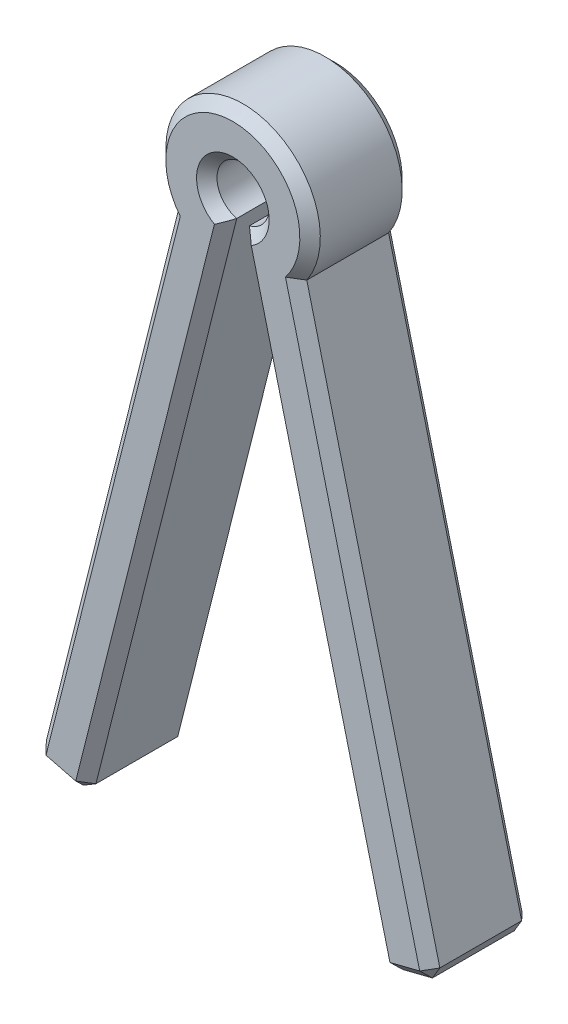
ISO-10303-21;
HEADER;
FILE_DESCRIPTION(('STEP AP214'),'2;1');
FILE_NAME('part.step','',(''),(''),'','','');
FILE_SCHEMA(('AUTOMOTIVE_DESIGN { 1 0 10303 214 1 1 1 1 }'));
ENDSEC;
DATA;
#1=APPLICATION_CONTEXT('core data for automotive mechanical design processes');
#2=APPLICATION_PROTOCOL_DEFINITION('international standard','automotive_design',2000,#1);
#3=PRODUCT_CONTEXT('',#1,'mechanical');
#4=PRODUCT('Part','Part','',(#3));
#5=PRODUCT_RELATED_PRODUCT_CATEGORY('part','',(#4));
#6=PRODUCT_DEFINITION_FORMATION('','',#4);
#7=PRODUCT_DEFINITION_CONTEXT('part definition',#1,'design');
#8=PRODUCT_DEFINITION('design','',#6,#7);
#9=PRODUCT_DEFINITION_SHAPE('','',#8);
#10=(LENGTH_UNIT() NAMED_UNIT(*) SI_UNIT(.MILLI.,.METRE.));
#11=(NAMED_UNIT(*) PLANE_ANGLE_UNIT() SI_UNIT($,.RADIAN.));
#12=(NAMED_UNIT(*) SI_UNIT($,.STERADIAN.) SOLID_ANGLE_UNIT());
#13=UNCERTAINTY_MEASURE_WITH_UNIT(LENGTH_MEASURE(1.E-05),#10,'distance_accuracy_value','');
#14=(GEOMETRIC_REPRESENTATION_CONTEXT(3) GLOBAL_UNCERTAINTY_ASSIGNED_CONTEXT((#13)) GLOBAL_UNIT_ASSIGNED_CONTEXT((#10,
#11,#12)) REPRESENTATION_CONTEXT('',''));
#15=CARTESIAN_POINT('',(0.,0.,0.));
#16=DIRECTION('',(0.,0.,1.));
#17=DIRECTION('',(1.,0.,0.));
#18=AXIS2_PLACEMENT_3D('',#15,#16,#17);
#19=CARTESIAN_POINT('',(-5.4708853835864,-1.2537595940453,10.));
#20=DIRECTION('',(0.969812360376083,-0.243852384982742,0.));
#21=DIRECTION('',(0.243852384982742,0.969812360376083,0.));
#22=AXIS2_PLACEMENT_3D('',#19,#20,#21);
#23=PLANE('',#22);
#24=DIRECTION('',(0.,0.,-1.));
#25=VECTOR('',#24,1.);
#26=CARTESIAN_POINT('',(-6.22855308533995,-4.26703954318473,10.));
#27=LINE('',#26,#25);
#28=CARTESIAN_POINT('',(-6.22855308533995,-4.26703954318473,8.99999999999999));
#29=VERTEX_POINT('',#28);
#30=CARTESIAN_POINT('',(-6.22855308533995,-4.26703954318473,1.00000000000001));
#31=VERTEX_POINT('',#30);
#32=EDGE_CURVE('E482',#29,#31,#27,.T.);
#33=ORIENTED_EDGE('',*,*,#32,.T.);
#34=DIRECTION('',(-0.243852384982742,-0.969812360376083,0.));
#35=VECTOR('',#34,1.);
#36=CARTESIAN_POINT('',(-5.4708853835864,-1.2537595940453,1.00000000000001));
#37=LINE('',#36,#35);
#38=CARTESIAN_POINT('',(-19.2363525158622,-55.9996673372752,1.00000000000001));
#39=VERTEX_POINT('',#38);
#40=EDGE_CURVE('E270',#31,#39,#37,.T.);
#41=ORIENTED_EDGE('',*,*,#40,.T.);
#42=DIRECTION('',(0.,0.,1.));
#43=VECTOR('',#42,1.);
#44=CARTESIAN_POINT('',(-19.2363525158622,-55.9996673372752,10.));
#45=LINE('',#44,#43);
#46=CARTESIAN_POINT('',(-19.2363525158622,-55.9996673372752,8.99999999999999));
#47=VERTEX_POINT('',#46);
#48=EDGE_CURVE('E266',#39,#47,#45,.T.);
#49=ORIENTED_EDGE('',*,*,#48,.T.);
#50=DIRECTION('',(0.243852384982742,0.969812360376083,0.));
#51=VECTOR('',#50,1.);
#52=CARTESIAN_POINT('',(-6.22855308533995,-4.26703954318473,8.99999999999999));
#53=LINE('',#52,#51);
#54=EDGE_CURVE('E268',#47,#29,#53,.T.);
#55=ORIENTED_EDGE('',*,*,#54,.T.);
#56=EDGE_LOOP('',(#33,#41,#49,#55));
#57=FACE_BOUND('',#56,.T.);
#58=ADVANCED_FACE('F43',(#57),#23,.F.);
#59=CARTESIAN_POINT('',(-14.6311430989645,-58.188741622565,10.));
#60=DIRECTION('',(-0.243852384982739,-0.969812360376083,0.));
#61=DIRECTION('',(0.969812360376083,-0.243852384982739,0.));
#62=AXIS2_PLACEMENT_3D('',#59,#60,#61);
#63=PLANE('',#62);
#64=DIRECTION('',(0.,0.,-1.));
#65=VECTOR('',#64,1.);
#66=CARTESIAN_POINT('',(-18.5103925404688,-57.213332082634,0.));
#67=LINE('',#66,#65);
#68=CARTESIAN_POINT('',(-18.5103925404688,-57.213332082634,9.));
#69=VERTEX_POINT('',#68);
#70=CARTESIAN_POINT('',(-18.5103925404688,-57.213332082634,0.999999999999997));
#71=VERTEX_POINT('',#70);
#72=EDGE_CURVE('E217',#69,#71,#67,.T.);
#73=ORIENTED_EDGE('',*,*,#72,.T.);
#74=DIRECTION('',(0.969812360376083,-0.243852384982739,0.));
#75=VECTOR('',#74,1.);
#76=CARTESIAN_POINT('',(-14.6311430989645,-58.188741622565,0.999999999999997));
#77=LINE('',#76,#75);
#78=CARTESIAN_POINT('',(-15.6009554593406,-57.9448892375822,0.999999999999997));
#79=VERTEX_POINT('',#78);
#80=EDGE_CURVE('E188',#71,#79,#77,.T.);
#81=ORIENTED_EDGE('',*,*,#80,.T.);
#82=DIRECTION('',(0.,0.,1.));
#83=VECTOR('',#82,1.);
#84=CARTESIAN_POINT('',(-15.6009554593406,-57.9448892375822,10.));
#85=LINE('',#84,#83);
#86=CARTESIAN_POINT('',(-15.6009554593406,-57.9448892375822,9.));
#87=VERTEX_POINT('',#86);
#88=EDGE_CURVE('E226',#79,#87,#85,.T.);
#89=ORIENTED_EDGE('',*,*,#88,.T.);
#90=DIRECTION('',(-0.969812360376083,0.243852384982739,0.));
#91=VECTOR('',#90,1.);
#92=CARTESIAN_POINT('',(-14.6311430989645,-58.188741622565,9.));
#93=LINE('',#92,#91);
#94=EDGE_CURVE('E219',#87,#69,#93,.T.);
#95=ORIENTED_EDGE('',*,*,#94,.T.);
#96=EDGE_LOOP('',(#73,#81,#89,#95));
#97=FACE_BOUND('',#96,.T.);
#98=ADVANCED_FACE('F526',(#97),#63,.T.);
#99=CARTESIAN_POINT('',(-0.621823581705991,-2.47302151895901,10.));
#100=DIRECTION('',(0.969812360376083,-0.243852384982742,0.));
#101=DIRECTION('',(0.243852384982742,0.969812360376083,0.));
#102=AXIS2_PLACEMENT_3D('',#99,#100,#101);
#103=PLANE('',#102);
#104=DIRECTION('',(0.,0.,-1.));
#105=VECTOR('',#104,1.);
#106=CARTESIAN_POINT('',(-14.3872907139818,-57.2189292621889,10.));
#107=LINE('',#106,#105);
#108=CARTESIAN_POINT('',(-14.3872907139818,-57.2189292621889,9.));
#109=VERTEX_POINT('',#108);
#110=CARTESIAN_POINT('',(-14.3872907139818,-57.2189292621889,1.00000000000001));
#111=VERTEX_POINT('',#110);
#112=EDGE_CURVE('E229',#109,#111,#107,.T.);
#113=ORIENTED_EDGE('',*,*,#112,.T.);
#114=DIRECTION('',(0.243852384982742,0.969812360376083,0.));
#115=VECTOR('',#114,1.);
#116=CARTESIAN_POINT('',(-0.621823581705991,-2.47302151895901,1.00000000000001));
#117=LINE('',#116,#115);
#118=CARTESIAN_POINT('',(-0.621823581705994,-2.47302151895901,1.00000000000001));
#119=VERTEX_POINT('',#118);
#120=EDGE_CURVE('E233',#111,#119,#117,.T.);
#121=ORIENTED_EDGE('',*,*,#120,.T.);
#122=DIRECTION('',(0.,0.,-1.));
#123=VECTOR('',#122,1.);
#124=CARTESIAN_POINT('',(-0.621823581705994,-2.47302151895901,10.));
#125=LINE('',#124,#123);
#126=CARTESIAN_POINT('',(-0.621823581705994,-2.47302151895901,9.));
#127=VERTEX_POINT('',#126);
#128=EDGE_CURVE('E211',#127,#119,#125,.T.);
#129=ORIENTED_EDGE('',*,*,#128,.F.);
#130=DIRECTION('',(-0.243852384982742,-0.969812360376083,0.));
#131=VECTOR('',#130,1.);
#132=CARTESIAN_POINT('',(-0.621823581705991,-2.47302151895901,9.));
#133=LINE('',#132,#131);
#134=EDGE_CURVE('E231',#127,#109,#133,.T.);
#135=ORIENTED_EDGE('',*,*,#134,.T.);
#136=EDGE_LOOP('',(#113,#121,#129,#135));
#137=FACE_BOUND('',#136,.T.);
#138=ADVANCED_FACE('F596',(#137),#103,.T.);
#139=CARTESIAN_POINT('',(0.,0.,10.));
#140=DIRECTION('',(0.,0.,-1.));
#141=DIRECTION('',(-1.,0.,0.));
#142=AXIS2_PLACEMENT_3D('',#139,#140,#141);
#143=CYLINDRICAL_SURFACE('',#142,2.55);
#144=ORIENTED_EDGE('',*,*,#128,.T.);
#145=CARTESIAN_POINT('',(0.,0.,1.00000000000001));
#146=DIRECTION('',(0.,0.,1.));
#147=DIRECTION('',(1.,0.,0.));
#148=AXIS2_PLACEMENT_3D('',#145,#146,#147);
#149=CIRCLE('',#148,2.55);
#150=CARTESIAN_POINT('',(0.621823581705991,-2.47302151895901,1.00000000000001));
#151=VERTEX_POINT('',#150);
#152=EDGE_CURVE('E238',#119,#151,#149,.F.);
#153=ORIENTED_EDGE('',*,*,#152,.T.);
#154=DIRECTION('',(0.,0.,-1.));
#155=VECTOR('',#154,1.);
#156=CARTESIAN_POINT('',(0.621823581705991,-2.47302151895901,10.));
#157=LINE('',#156,#155);
#158=CARTESIAN_POINT('',(0.621823581705991,-2.47302151895901,9.));
#159=VERTEX_POINT('',#158);
#160=EDGE_CURVE('E493',#159,#151,#157,.T.);
#161=ORIENTED_EDGE('',*,*,#160,.F.);
#162=CARTESIAN_POINT('',(0.,0.,9.));
#163=DIRECTION('',(0.,0.,1.));
#164=DIRECTION('',(1.,0.,0.));
#165=AXIS2_PLACEMENT_3D('',#162,#163,#164);
#166=CIRCLE('',#165,2.55);
#167=EDGE_CURVE('E236',#159,#127,#166,.T.);
#168=ORIENTED_EDGE('',*,*,#167,.T.);
#169=EDGE_LOOP('',(#144,#153,#161,#168));
#170=FACE_BOUND('',#169,.T.);
#171=ADVANCED_FACE('F821',(#170),#143,.F.);
#172=CARTESIAN_POINT('',(0.621823581705991,-2.47302151895901,10.));
#173=DIRECTION('',(-0.969812360376083,-0.243852384982742,0.));
#174=DIRECTION('',(0.243852384982742,-0.969812360376083,0.));
#175=AXIS2_PLACEMENT_3D('',#172,#173,#174);
#176=PLANE('',#175);
#177=ORIENTED_EDGE('',*,*,#160,.T.);
#178=DIRECTION('',(0.243852384982742,-0.969812360376083,0.));
#179=VECTOR('',#178,1.);
#180=CARTESIAN_POINT('',(14.6311430989645,-58.188741622565,1.00000000000001));
#181=LINE('',#180,#179);
#182=CARTESIAN_POINT('',(14.3872907139818,-57.2189292621889,1.00000000000001));
#183=VERTEX_POINT('',#182);
#184=EDGE_CURVE('E244',#151,#183,#181,.T.);
#185=ORIENTED_EDGE('',*,*,#184,.T.);
#186=DIRECTION('',(0.,0.,1.));
#187=VECTOR('',#186,1.);
#188=CARTESIAN_POINT('',(14.3872907139818,-57.2189292621889,10.));
#189=LINE('',#188,#187);
#190=CARTESIAN_POINT('',(14.3872907139818,-57.2189292621889,9.));
#191=VERTEX_POINT('',#190);
#192=EDGE_CURVE('E242',#183,#191,#189,.T.);
#193=ORIENTED_EDGE('',*,*,#192,.T.);
#194=DIRECTION('',(-0.243852384982742,0.969812360376083,0.));
#195=VECTOR('',#194,1.);
#196=CARTESIAN_POINT('',(0.621823581705991,-2.47302151895901,9.));
#197=LINE('',#196,#195);
#198=EDGE_CURVE('E240',#191,#159,#197,.T.);
#199=ORIENTED_EDGE('',*,*,#198,.T.);
#200=EDGE_LOOP('',(#177,#185,#193,#199));
#201=FACE_BOUND('',#200,.T.);
#202=ADVANCED_FACE('F812',(#201),#176,.T.);
#203=CARTESIAN_POINT('',(19.4802049008449,-56.9694796976513,10.));
#204=DIRECTION('',(0.243852384982739,-0.969812360376083,0.));
#205=DIRECTION('',(0.969812360376083,0.243852384982739,0.));
#206=AXIS2_PLACEMENT_3D('',#203,#204,#205);
#207=PLANE('',#206);
#208=DIRECTION('',(0.,0.,-1.));
#209=VECTOR('',#208,1.);
#210=CARTESIAN_POINT('',(15.6009554593406,-57.9448892375822,10.));
#211=LINE('',#210,#209);
#212=CARTESIAN_POINT('',(15.6009554593406,-57.9448892375822,9.));
#213=VERTEX_POINT('',#212);
#214=CARTESIAN_POINT('',(15.6009554593406,-57.9448892375822,1.00000000000001));
#215=VERTEX_POINT('',#214);
#216=EDGE_CURVE('E246',#213,#215,#211,.T.);
#217=ORIENTED_EDGE('',*,*,#216,.T.);
#218=DIRECTION('',(0.969812360376083,0.243852384982739,0.));
#219=VECTOR('',#218,1.);
#220=CARTESIAN_POINT('',(19.4802049008449,-56.9694796976513,1.00000000000001));
#221=LINE('',#220,#219);
#222=CARTESIAN_POINT('',(18.5103925404688,-57.213332082634,1.00000000000001));
#223=VERTEX_POINT('',#222);
#224=EDGE_CURVE('E252',#215,#223,#221,.T.);
#225=ORIENTED_EDGE('',*,*,#224,.T.);
#226=DIRECTION('',(0.,0.,1.));
#227=VECTOR('',#226,1.);
#228=CARTESIAN_POINT('',(18.5103925404688,-57.213332082634,10.));
#229=LINE('',#228,#227);
#230=CARTESIAN_POINT('',(18.5103925404688,-57.213332082634,9.));
#231=VERTEX_POINT('',#230);
#232=EDGE_CURVE('E250',#223,#231,#229,.T.);
#233=ORIENTED_EDGE('',*,*,#232,.T.);
#234=DIRECTION('',(-0.969812360376083,-0.243852384982739,0.));
#235=VECTOR('',#234,1.);
#236=CARTESIAN_POINT('',(19.4802049008449,-56.9694796976513,9.));
#237=LINE('',#236,#235);
#238=EDGE_CURVE('E248',#231,#213,#237,.T.);
#239=ORIENTED_EDGE('',*,*,#238,.T.);
#240=EDGE_LOOP('',(#217,#225,#233,#239));
#241=FACE_BOUND('',#240,.T.);
#242=ADVANCED_FACE('F804',(#241),#207,.T.);
#243=CARTESIAN_POINT('',(5.4708853835864,-1.2537595940453,10.));
#244=DIRECTION('',(-0.969812360376083,-0.243852384982742,0.));
#245=DIRECTION('',(0.243852384982742,-0.969812360376083,0.));
#246=AXIS2_PLACEMENT_3D('',#243,#244,#245);
#247=PLANE('',#246);
#248=DIRECTION('',(0.,0.,-1.));
#249=VECTOR('',#248,1.);
#250=CARTESIAN_POINT('',(19.2363525158622,-55.9996673372752,0.));
#251=LINE('',#250,#249);
#252=CARTESIAN_POINT('',(19.2363525158622,-55.9996673372752,8.99999999999999));
#253=VERTEX_POINT('',#252);
#254=CARTESIAN_POINT('',(19.2363525158622,-55.9996673372752,0.999999999999997));
#255=VERTEX_POINT('',#254);
#256=EDGE_CURVE('E255',#253,#255,#251,.T.);
#257=ORIENTED_EDGE('',*,*,#256,.T.);
#258=DIRECTION('',(-0.243852384982742,0.969812360376083,0.));
#259=VECTOR('',#258,1.);
#260=CARTESIAN_POINT('',(5.4708853835864,-1.2537595940453,0.999999999999997));
#261=LINE('',#260,#259);
#262=CARTESIAN_POINT('',(6.22855308533995,-4.26703954318473,0.999999999999997));
#263=VERTEX_POINT('',#262);
#264=EDGE_CURVE('E259',#255,#263,#261,.T.);
#265=ORIENTED_EDGE('',*,*,#264,.T.);
#266=DIRECTION('',(0.,0.,-1.));
#267=VECTOR('',#266,1.);
#268=CARTESIAN_POINT('',(6.22855308533995,-4.26703954318473,10.));
#269=LINE('',#268,#267);
#270=CARTESIAN_POINT('',(6.22855308533995,-4.26703954318473,8.99999999999999));
#271=VERTEX_POINT('',#270);
#272=EDGE_CURVE('E488',#271,#263,#269,.T.);
#273=ORIENTED_EDGE('',*,*,#272,.F.);
#274=DIRECTION('',(0.243852384982742,-0.969812360376083,0.));
#275=VECTOR('',#274,1.);
#276=CARTESIAN_POINT('',(19.4802049008449,-56.9694796976513,8.99999999999999));
#277=LINE('',#276,#275);
#278=EDGE_CURVE('E257',#271,#253,#277,.T.);
#279=ORIENTED_EDGE('',*,*,#278,.T.);
#280=EDGE_LOOP('',(#257,#265,#273,#279));
#281=FACE_BOUND('',#280,.T.);
#282=ADVANCED_FACE('F553',(#281),#247,.F.);
#283=CARTESIAN_POINT('',(0.,0.,10.));
#284=DIRECTION('',(0.,0.,-1.));
#285=DIRECTION('',(-1.,0.,0.));
#286=AXIS2_PLACEMENT_3D('',#283,#284,#285);
#287=CYLINDRICAL_SURFACE('',#286,7.55);
#288=ORIENTED_EDGE('',*,*,#272,.T.);
#289=CARTESIAN_POINT('',(0.,0.,0.999999999999997));
#290=DIRECTION('',(0.,0.,1.));
#291=DIRECTION('',(1.,0.,0.));
#292=AXIS2_PLACEMENT_3D('',#289,#290,#291);
#293=CIRCLE('',#292,7.55);
#294=EDGE_CURVE('E264',#263,#31,#293,.T.);
#295=ORIENTED_EDGE('',*,*,#294,.T.);
#296=ORIENTED_EDGE('',*,*,#32,.F.);
#297=CARTESIAN_POINT('',(0.,0.,8.99999999999999));
#298=DIRECTION('',(0.,0.,1.));
#299=DIRECTION('',(1.,0.,0.));
#300=AXIS2_PLACEMENT_3D('',#297,#298,#299);
#301=CIRCLE('',#300,7.55);
#302=EDGE_CURVE('E262',#29,#271,#301,.F.);
#303=ORIENTED_EDGE('',*,*,#302,.T.);
#304=EDGE_LOOP('',(#288,#295,#296,#303));
#305=FACE_BOUND('',#304,.T.);
#306=ADVANCED_FACE('F558',(#305),#287,.T.);
#307=CARTESIAN_POINT('',(0.,0.,10.));
#308=DIRECTION('',(0.,0.,1.));
#309=DIRECTION('',(1.,0.,0.));
#310=AXIS2_PLACEMENT_3D('',#307,#308,#309);
#311=PLANE('',#310);
#312=DIRECTION('',(-0.243852384982742,0.969812360376083,0.));
#313=VECTOR('',#312,1.);
#314=CARTESIAN_POINT('',(5.25874072496387,-4.51089192816748,10.));
#315=LINE('',#314,#313);
#316=CARTESIAN_POINT('',(18.2665401554861,-56.2435197222579,10.));
#317=VERTEX_POINT('',#316);
#318=CARTESIAN_POINT('',(5.14405372449273,-4.05477635382427,10.));
#319=VERTEX_POINT('',#318);
#320=EDGE_CURVE('E53',#317,#319,#315,.T.);
#321=ORIENTED_EDGE('',*,*,#320,.T.);
#322=CARTESIAN_POINT('',(0.,0.,10.));
#323=DIRECTION('',(0.,0.,1.));
#324=DIRECTION('',(1.,0.,0.));
#325=AXIS2_PLACEMENT_3D('',#322,#323,#324);
#326=CIRCLE('',#325,6.55);
#327=CARTESIAN_POINT('',(-5.14405372449273,-4.05477635382428,10.));
#328=VERTEX_POINT('',#327);
#329=EDGE_CURVE('E11',#319,#328,#326,.T.);
#330=ORIENTED_EDGE('',*,*,#329,.T.);
#331=DIRECTION('',(-0.243852384982742,-0.969812360376083,0.));
#332=VECTOR('',#331,1.);
#333=CARTESIAN_POINT('',(-18.5103925404688,-57.213332082634,10.));
#334=LINE('',#333,#332);
#335=CARTESIAN_POINT('',(-18.2665401554861,-56.2435197222579,10.));
#336=VERTEX_POINT('',#335);
#337=EDGE_CURVE('E272',#328,#336,#334,.T.);
#338=ORIENTED_EDGE('',*,*,#337,.T.);
#339=DIRECTION('',(0.969812360376084,-0.243852384982739,0.));
#340=VECTOR('',#339,1.);
#341=CARTESIAN_POINT('',(-14.3872907139816,-57.2189292621889,10.));
#342=LINE('',#341,#340);
#343=CARTESIAN_POINT('',(-15.3571030743578,-56.9750768772061,10.));
#344=VERTEX_POINT('',#343);
#345=EDGE_CURVE('E274',#336,#344,#342,.T.);
#346=ORIENTED_EDGE('',*,*,#345,.T.);
#347=DIRECTION('',(0.243852384982742,0.969812360376083,0.));
#348=VECTOR('',#347,1.);
#349=CARTESIAN_POINT('',(-0.969812360376089,0.243852384982743,10.));
#350=LINE('',#349,#348);
#351=CARTESIAN_POINT('',(-1.80043314848622,-3.05956540669292,10.));
#352=VERTEX_POINT('',#351);
#353=EDGE_CURVE('E276',#344,#352,#350,.T.);
#354=ORIENTED_EDGE('',*,*,#353,.T.);
#355=CARTESIAN_POINT('',(0.,0.,10.));
#356=DIRECTION('',(0.,0.,1.));
#357=DIRECTION('',(1.,0.,0.));
#358=AXIS2_PLACEMENT_3D('',#355,#356,#357);
#359=CIRCLE('',#358,3.55000000000001);
#360=CARTESIAN_POINT('',(1.80043314848623,-3.05956540669292,10.));
#361=VERTEX_POINT('',#360);
#362=EDGE_CURVE('E278',#352,#361,#359,.F.);
#363=ORIENTED_EDGE('',*,*,#362,.T.);
#364=DIRECTION('',(0.243852384982742,-0.969812360376083,0.));
#365=VECTOR('',#364,1.);
#366=CARTESIAN_POINT('',(0.96981236037609,0.243852384982743,10.));
#367=LINE('',#366,#365);
#368=CARTESIAN_POINT('',(15.3571030743578,-56.9750768772061,10.));
#369=VERTEX_POINT('',#368);
#370=EDGE_CURVE('E280',#361,#369,#367,.T.);
#371=ORIENTED_EDGE('',*,*,#370,.T.);
#372=DIRECTION('',(0.969812360376084,0.243852384982739,0.));
#373=VECTOR('',#372,1.);
#374=CARTESIAN_POINT('',(14.3872907139816,-57.2189292621889,10.));
#375=LINE('',#374,#373);
#376=EDGE_CURVE('E64',#369,#317,#375,.T.);
#377=ORIENTED_EDGE('',*,*,#376,.T.);
#378=EDGE_LOOP('',(#321,#330,#338,#346,#354,#363,#371,#377));
#379=FACE_BOUND('',#378,.T.);
#380=ADVANCED_FACE('F582',(#379),#311,.T.);
#381=CARTESIAN_POINT('',(0.,0.,0.));
#382=DIRECTION('',(0.,0.,1.));
#383=DIRECTION('',(1.,0.,0.));
#384=AXIS2_PLACEMENT_3D('',#381,#382,#383);
#385=PLANE('',#384);
#386=DIRECTION('',(-0.243852384982742,-0.969812360376083,0.));
#387=VECTOR('',#386,1.);
#388=CARTESIAN_POINT('',(-15.6009554593406,-57.9448892375822,0.));
#389=LINE('',#388,#387);
#390=CARTESIAN_POINT('',(-1.80043314848621,-3.05956540669292,0.));
#391=VERTEX_POINT('',#390);
#392=CARTESIAN_POINT('',(-15.3571030743578,-56.9750768772061,0.));
#393=VERTEX_POINT('',#392);
#394=EDGE_CURVE('E215',#391,#393,#389,.T.);
#395=ORIENTED_EDGE('',*,*,#394,.T.);
#396=DIRECTION('',(-0.969812360376084,0.243852384982739,0.));
#397=VECTOR('',#396,1.);
#398=CARTESIAN_POINT('',(-19.2363525158622,-55.9996673372752,0.));
#399=LINE('',#398,#397);
#400=CARTESIAN_POINT('',(-18.2665401554861,-56.2435197222579,0.));
#401=VERTEX_POINT('',#400);
#402=EDGE_CURVE('E186',#393,#401,#399,.T.);
#403=ORIENTED_EDGE('',*,*,#402,.T.);
#404=DIRECTION('',(0.243852384982742,0.969812360376083,0.));
#405=VECTOR('',#404,1.);
#406=CARTESIAN_POINT('',(-3.87924944150433,0.975409539930967,0.));
#407=LINE('',#406,#405);
#408=CARTESIAN_POINT('',(-5.14405372449273,-4.05477635382426,0.));
#409=VERTEX_POINT('',#408);
#410=EDGE_CURVE('E204',#401,#409,#407,.T.);
#411=ORIENTED_EDGE('',*,*,#410,.T.);
#412=CARTESIAN_POINT('',(0.,0.,0.));
#413=DIRECTION('',(0.,0.,1.));
#414=DIRECTION('',(1.,0.,0.));
#415=AXIS2_PLACEMENT_3D('',#412,#413,#414);
#416=CIRCLE('',#415,6.54999999999999);
#417=CARTESIAN_POINT('',(5.14405372449272,-4.05477635382427,0.));
#418=VERTEX_POINT('',#417);
#419=EDGE_CURVE('E210',#409,#418,#416,.F.);
#420=ORIENTED_EDGE('',*,*,#419,.T.);
#421=DIRECTION('',(0.243852384982742,-0.969812360376083,0.));
#422=VECTOR('',#421,1.);
#423=CARTESIAN_POINT('',(3.87924944150433,0.975409539930965,0.));
#424=LINE('',#423,#422);
#425=CARTESIAN_POINT('',(18.2665401554861,-56.2435197222579,0.));
#426=VERTEX_POINT('',#425);
#427=EDGE_CURVE('E501',#418,#426,#424,.T.);
#428=ORIENTED_EDGE('',*,*,#427,.T.);
#429=DIRECTION('',(-0.969812360376084,-0.243852384982739,0.));
#430=VECTOR('',#429,1.);
#431=CARTESIAN_POINT('',(14.3872907139818,-57.2189292621889,0.));
#432=LINE('',#431,#430);
#433=CARTESIAN_POINT('',(15.3571030743578,-56.9750768772061,0.));
#434=VERTEX_POINT('',#433);
#435=EDGE_CURVE('E503',#426,#434,#432,.T.);
#436=ORIENTED_EDGE('',*,*,#435,.T.);
#437=DIRECTION('',(-0.243852384982742,0.969812360376083,0.));
#438=VECTOR('',#437,1.);
#439=CARTESIAN_POINT('',(1.59163594208207,-2.22916913397627,0.));
#440=LINE('',#439,#438);
#441=CARTESIAN_POINT('',(1.80043314848621,-3.05956540669292,0.));
#442=VERTEX_POINT('',#441);
#443=EDGE_CURVE('E505',#434,#442,#440,.T.);
#444=ORIENTED_EDGE('',*,*,#443,.T.);
#445=CARTESIAN_POINT('',(0.,0.,0.));
#446=DIRECTION('',(0.,0.,1.));
#447=DIRECTION('',(1.,0.,0.));
#448=AXIS2_PLACEMENT_3D('',#445,#446,#447);
#449=CIRCLE('',#448,3.55);
#450=EDGE_CURVE('E221',#442,#391,#449,.T.);
#451=ORIENTED_EDGE('',*,*,#450,.T.);
#452=EDGE_LOOP('',(#395,#403,#411,#420,#428,#436,#444,#451));
#453=FACE_BOUND('',#452,.T.);
#454=ADVANCED_FACE('F213',(#453),#385,.F.);
#455=CARTESIAN_POINT('',(19.4802049008449,-56.9694796976513,9.));
#456=DIRECTION('',(-0.172429675029807,0.685760896500458,-0.707106781186549));
#457=DIRECTION('',(-0.969812360376083,-0.243852384982739,0.));
#458=AXIS2_PLACEMENT_3D('',#455,#456,#457);
#459=PLANE('',#458);
#460=DIRECTION('',(0.172429675029796,-0.685760896500465,-0.707106781186545));
#461=VECTOR('',#460,1.);
#462=CARTESIAN_POINT('',(15.6009554593406,-57.9448892375822,9.));
#463=LINE('',#462,#461);
#464=EDGE_CURVE('E48',#213,#369,#463,.F.);
#465=ORIENTED_EDGE('',*,*,#464,.F.);
#466=ORIENTED_EDGE('',*,*,#238,.F.);
#467=DIRECTION('',(-0.172429675029795,0.685760896500465,0.707106781186545));
#468=VECTOR('',#467,1.);
#469=CARTESIAN_POINT('',(18.3884663479775,-56.728425902446,9.50000000000001));
#470=LINE('',#469,#468);
#471=EDGE_CURVE('E476',#317,#231,#470,.F.);
#472=ORIENTED_EDGE('',*,*,#471,.F.);
#473=ORIENTED_EDGE('',*,*,#376,.F.);
#474=EDGE_LOOP('',(#465,#466,#472,#473));
#475=FACE_BOUND('',#474,.T.);
#476=ADVANCED_FACE('F46',(#475),#459,.F.);
#477=CARTESIAN_POINT('',(15.6009554593406,-57.9448892375822,9.));
#478=DIRECTION('',(-0.419133187214245,-0.700709667438868,0.577350269189631));
#479=DIRECTION('',(0.,-0.635901006428362,-0.771770633040281));
#480=AXIS2_PLACEMENT_3D('',#477,#478,#479);
#481=PLANE('',#480);
#482=DIRECTION('',(-0.858190571530264,0.51333122147066,0.));
#483=VECTOR('',#482,1.);
#484=CARTESIAN_POINT('',(15.6009554593406,-57.9448892375822,9.00000000000001));
#485=LINE('',#484,#483);
#486=EDGE_CURVE('E471',#213,#191,#485,.T.);
#487=ORIENTED_EDGE('',*,*,#486,.F.);
#488=ORIENTED_EDGE('',*,*,#464,.T.);
#489=DIRECTION('',(0.685760896500464,0.172429675029807,0.707106781186544));
#490=VECTOR('',#489,1.);
#491=CARTESIAN_POINT('',(14.8721968941698,-57.0970030696975,9.5));
#492=LINE('',#491,#490);
#493=EDGE_CURVE('E474',#191,#369,#492,.T.);
#494=ORIENTED_EDGE('',*,*,#493,.F.);
#495=EDGE_LOOP('',(#487,#488,#494));
#496=FACE_BOUND('',#495,.T.);
#497=ADVANCED_FACE('F769',(#496),#481,.T.);
#498=CARTESIAN_POINT('',(19.2363525158622,-55.9996673372752,8.99999999999999));
#499=DIRECTION('',(0.70070966743888,-0.419133187214242,0.57735026918962));
#500=DIRECTION('',(0.635901006428348,0.,-0.771770633040293));
#501=AXIS2_PLACEMENT_3D('',#498,#499,#500);
#502=PLANE('',#501);
#503=DIRECTION('',(-0.685760896500455,-0.172429675029812,0.707106781186551));
#504=VECTOR('',#503,1.);
#505=CARTESIAN_POINT('',(19.2363525158622,-55.9996673372752,8.99999999999999));
#506=LINE('',#505,#504);
#507=EDGE_CURVE('E463',#317,#253,#506,.F.);
#508=ORIENTED_EDGE('',*,*,#507,.F.);
#509=ORIENTED_EDGE('',*,*,#471,.T.);
#510=DIRECTION('',(0.513331221470655,0.858190571530267,0.));
#511=VECTOR('',#510,1.);
#512=CARTESIAN_POINT('',(19.2363525158622,-55.9996673372752,8.99999999999999));
#513=LINE('',#512,#511);
#514=EDGE_CURVE('E468',#253,#231,#513,.F.);
#515=ORIENTED_EDGE('',*,*,#514,.F.);
#516=EDGE_LOOP('',(#508,#509,#515));
#517=FACE_BOUND('',#516,.T.);
#518=ADVANCED_FACE('F451',(#517),#502,.T.);
#519=CARTESIAN_POINT('',(0.621823581705991,-2.47302151895901,9.));
#520=DIRECTION('',(0.685760896500457,0.172429675029808,-0.707106781186551));
#521=DIRECTION('',(-0.243852384982742,0.969812360376083,0.));
#522=AXIS2_PLACEMENT_3D('',#519,#520,#521);
#523=PLANE('',#522);
#524=ORIENTED_EDGE('',*,*,#493,.T.);
#525=ORIENTED_EDGE('',*,*,#370,.F.);
#526=CARTESIAN_POINT('',(0.621823581705991,-2.47302151895901,9.));
#527=CARTESIAN_POINT('',(0.718516425856111,-2.53081915923219,9.07967982298972));
#528=CARTESIAN_POINT('',(0.81576884561923,-2.58595741602648,9.16055082632939));
#529=CARTESIAN_POINT('',(1.01103957683882,-2.69154096870977,9.32417999394905));
#530=CARTESIAN_POINT('',(1.10905701268095,-2.74199096183777,9.4069361636145));
#531=CARTESIAN_POINT('',(1.3056608955774,-2.83891814342304,9.57396911494618));
#532=CARTESIAN_POINT('',(1.40424709132246,-2.88539696155672,9.65824525548911));
#533=CARTESIAN_POINT('',(1.60198059803206,-2.97493793813031,9.82817487366544));
#534=CARTESIAN_POINT('',(1.70112837526356,-3.01799659727981,9.9138296568006));
#535=CARTESIAN_POINT('',(1.80043314848623,-3.05956540669292,10.));
#536=B_SPLINE_CURVE_WITH_KNOTS('',3,(#526,#527,#528,#529,#530,#531,#532,#533,#534,#535),
.UNSPECIFIED.,.F.,.F.,(4,2,2,2,4),(0.,0.413864395493051,0.827309559834807,1.24058423285536,
1.65427643703107),.UNSPECIFIED.);
#537=EDGE_CURVE('E455',#159,#361,#536,.T.);
#538=ORIENTED_EDGE('',*,*,#537,.F.);
#539=ORIENTED_EDGE('',*,*,#198,.F.);
#540=EDGE_LOOP('',(#524,#525,#538,#539));
#541=FACE_BOUND('',#540,.T.);
#542=ADVANCED_FACE('F443',(#541),#523,.F.);
#543=CARTESIAN_POINT('',(15.6009554593406,-57.9448892375822,10.));
#544=DIRECTION('',(0.51333122147066,0.858190571530264,0.));
#545=DIRECTION('',(0.,0.,-1.));
#546=AXIS2_PLACEMENT_3D('',#543,#544,#545);
#547=PLANE('',#546);
#548=ORIENTED_EDGE('',*,*,#486,.T.);
#549=ORIENTED_EDGE('',*,*,#192,.F.);
#550=DIRECTION('',(0.858190571530263,-0.51333122147066,0.));
#551=VECTOR('',#550,1.);
#552=CARTESIAN_POINT('',(14.3872907139818,-57.2189292621889,1.00000000000001));
#553=LINE('',#552,#551);
#554=EDGE_CURVE('E464',#215,#183,#553,.F.);
#555=ORIENTED_EDGE('',*,*,#554,.F.);
#556=ORIENTED_EDGE('',*,*,#216,.F.);
#557=EDGE_LOOP('',(#548,#549,#555,#556));
#558=FACE_BOUND('',#557,.T.);
#559=ADVANCED_FACE('F450',(#558),#547,.F.);
#560=CARTESIAN_POINT('',(14.3872907139816,-57.2189292621889,0.));
#561=DIRECTION('',(0.172429675029808,-0.685760896500462,-0.707106781186546));
#562=DIRECTION('',(0.969812360376083,0.243852384982739,0.));
#563=AXIS2_PLACEMENT_3D('',#560,#561,#562);
#564=PLANE('',#563);
#565=DIRECTION('',(-0.1724296750298,0.68576089650046,-0.707106781186549));
#566=VECTOR('',#565,1.);
#567=CARTESIAN_POINT('',(18.5103925404688,-57.213332082634,1.00000000000001));
#568=LINE('',#567,#566);
#569=EDGE_CURVE('E566',#223,#426,#568,.T.);
#570=ORIENTED_EDGE('',*,*,#569,.F.);
#571=ORIENTED_EDGE('',*,*,#224,.F.);
#572=DIRECTION('',(0.172429675029806,-0.685760896500459,0.707106781186549));
#573=VECTOR('',#572,1.);
#574=CARTESIAN_POINT('',(15.4790292668492,-57.4599830573942,0.500000000000004));
#575=LINE('',#574,#573);
#576=EDGE_CURVE('E870',#434,#215,#575,.T.);
#577=ORIENTED_EDGE('',*,*,#576,.F.);
#578=ORIENTED_EDGE('',*,*,#435,.F.);
#579=EDGE_LOOP('',(#570,#571,#577,#578));
#580=FACE_BOUND('',#579,.T.);
#581=ADVANCED_FACE('F742',(#580),#564,.T.);
#582=CARTESIAN_POINT('',(19.2363525158622,-55.9996673372752,10.));
#583=DIRECTION('',(0.858190571530267,-0.513331221470655,0.));
#584=DIRECTION('',(0.,0.,1.));
#585=AXIS2_PLACEMENT_3D('',#582,#583,#584);
#586=PLANE('',#585);
#587=ORIENTED_EDGE('',*,*,#514,.T.);
#588=ORIENTED_EDGE('',*,*,#232,.F.);
#589=DIRECTION('',(-0.513331221470655,-0.858190571530267,0.));
#590=VECTOR('',#589,1.);
#591=CARTESIAN_POINT('',(18.5103925404688,-57.213332082634,1.00000000000001));
#592=LINE('',#591,#590);
#593=EDGE_CURVE('E408',#255,#223,#592,.T.);
#594=ORIENTED_EDGE('',*,*,#593,.F.);
#595=ORIENTED_EDGE('',*,*,#256,.F.);
#596=EDGE_LOOP('',(#587,#588,#594,#595));
#597=FACE_BOUND('',#596,.T.);
#598=ADVANCED_FACE('F427',(#597),#586,.T.);
#599=CARTESIAN_POINT('',(3.87924944150433,0.975409539930967,10.));
#600=DIRECTION('',(0.685760896500463,0.17242967502981,0.707106781186544));
#601=DIRECTION('',(0.243852384982742,-0.969812360376083,0.));
#602=AXIS2_PLACEMENT_3D('',#599,#600,#601);
#603=PLANE('',#602);
#604=ORIENTED_EDGE('',*,*,#507,.T.);
#605=ORIENTED_EDGE('',*,*,#278,.F.);
#606=CARTESIAN_POINT('',(6.22855308533995,-4.26703954318473,8.99999999999999));
#607=CARTESIAN_POINT('',(6.13820445419294,-4.25086392151886,9.08367675530761));
#608=CARTESIAN_POINT('',(6.04784700458081,-4.23433857149635,9.16727678077786));
#609=CARTESIAN_POINT('',(5.86712093192329,-4.20054701898052,9.33430700921009));
#610=CARTESIAN_POINT('',(5.77675230950946,-4.1832808477454,9.41773721918199));
#611=CARTESIAN_POINT('',(5.59600208552076,-4.14796477308037,9.58441911151167));
#612=CARTESIAN_POINT('',(5.50562048385698,-4.12991486399788,9.66767079257731));
#613=CARTESIAN_POINT('',(5.32484469891659,-4.09298220779097,9.83398326696939));
#614=CARTESIAN_POINT('',(5.23445051527018,-4.07409942558395,9.91704405209949));
#615=CARTESIAN_POINT('',(5.14405372449273,-4.05477635382427,10.));
#616=B_SPLINE_CURVE_WITH_KNOTS('',3,(#606,#607,#608,#609,#610,#611,#612,#613,#614,#615),
.UNSPECIFIED.,.F.,.F.,(4,2,2,2,4),(0.,0.372608144040249,0.745200581685523,1.11779570703761,
1.49040654200859),.UNSPECIFIED.);
#617=EDGE_CURVE('E399',#319,#271,#616,.F.);
#618=ORIENTED_EDGE('',*,*,#617,.F.);
#619=ORIENTED_EDGE('',*,*,#320,.F.);
#620=EDGE_LOOP('',(#604,#605,#618,#619));
#621=FACE_BOUND('',#620,.T.);
#622=ADVANCED_FACE('F418',(#621),#603,.T.);
#623=CARTESIAN_POINT('',(0.,0.,9.));
#624=DIRECTION('',(0.,0.,1.));
#625=DIRECTION('',(1.,0.,0.));
#626=AXIS2_PLACEMENT_3D('',#623,#624,#625);
#627=CONICAL_SURFACE('',#626,2.55,0.785398163397453);
#628=ORIENTED_EDGE('',*,*,#537,.T.);
#629=ORIENTED_EDGE('',*,*,#362,.F.);
#630=CARTESIAN_POINT('',(-0.621823581705994,-2.47302151895901,9.));
#631=CARTESIAN_POINT('',(-0.718516425856113,-2.53081915923219,9.07967982298971));
#632=CARTESIAN_POINT('',(-0.81576884561923,-2.58595741602648,9.16055082632939));
#633=CARTESIAN_POINT('',(-1.01103957683882,-2.69154096870977,9.32417999394905));
#634=CARTESIAN_POINT('',(-1.10905701268095,-2.74199096183777,9.4069361636145));
#635=CARTESIAN_POINT('',(-1.3056608955774,-2.83891814342304,9.57396911494618));
#636=CARTESIAN_POINT('',(-1.40424709132246,-2.88539696155672,9.65824525548911));
#637=CARTESIAN_POINT('',(-1.60198059803206,-2.97493793813031,9.82817487366544));
#638=CARTESIAN_POINT('',(-1.70112837526356,-3.01799659727981,9.9138296568006));
#639=CARTESIAN_POINT('',(-1.80043314848622,-3.05956540669292,10.));
#640=B_SPLINE_CURVE_WITH_KNOTS('',3,(#630,#631,#632,#633,#634,#635,#636,#637,#638,#639),
.UNSPECIFIED.,.F.,.F.,(4,2,2,2,4),(0.,0.41386439549305,0.827309559834807,1.24058423285536,
1.65427643703107),.UNSPECIFIED.);
#641=EDGE_CURVE('E409',#127,#352,#640,.T.);
#642=ORIENTED_EDGE('',*,*,#641,.F.);
#643=ORIENTED_EDGE('',*,*,#167,.F.);
#644=EDGE_LOOP('',(#628,#629,#642,#643));
#645=FACE_BOUND('',#644,.T.);
#646=ADVANCED_FACE('F426',(#645),#627,.F.);
#647=CARTESIAN_POINT('',(14.3872907139818,-57.2189292621889,1.00000000000001));
#648=DIRECTION('',(-0.419133187214248,-0.700709667438874,-0.577350269189621));
#649=DIRECTION('',(0.,0.635901006428352,-0.77177063304029));
#650=AXIS2_PLACEMENT_3D('',#647,#648,#649);
#651=PLANE('',#650);
#652=ORIENTED_EDGE('',*,*,#576,.T.);
#653=ORIENTED_EDGE('',*,*,#554,.T.);
#654=DIRECTION('',(0.685760896500459,0.1724296750298,-0.707106781186551));
#655=VECTOR('',#654,1.);
#656=CARTESIAN_POINT('',(14.3872907139818,-57.2189292621889,1.00000000000001));
#657=LINE('',#656,#655);
#658=EDGE_CURVE('E568',#434,#183,#657,.F.);
#659=ORIENTED_EDGE('',*,*,#658,.F.);
#660=EDGE_LOOP('',(#652,#653,#659));
#661=FACE_BOUND('',#660,.T.);
#662=ADVANCED_FACE('F435',(#661),#651,.T.);
#663=CARTESIAN_POINT('',(18.5103925404688,-57.213332082634,1.00000000000001));
#664=DIRECTION('',(0.700709667438873,-0.419133187214248,-0.577350269189623));
#665=DIRECTION('',(-0.635901006428353,0.,-0.771770633040289));
#666=AXIS2_PLACEMENT_3D('',#663,#664,#665);
#667=PLANE('',#666);
#668=ORIENTED_EDGE('',*,*,#593,.T.);
#669=ORIENTED_EDGE('',*,*,#569,.T.);
#670=DIRECTION('',(-0.685760896500462,-0.172429675029817,-0.707106781186543));
#671=VECTOR('',#670,1.);
#672=CARTESIAN_POINT('',(18.7514463356741,-56.1215935297666,0.49999999999999));
#673=LINE('',#672,#671);
#674=EDGE_CURVE('E567',#255,#426,#673,.T.);
#675=ORIENTED_EDGE('',*,*,#674,.F.);
#676=EDGE_LOOP('',(#668,#669,#675));
#677=FACE_BOUND('',#676,.T.);
#678=ADVANCED_FACE('F386',(#677),#667,.T.);
#679=CARTESIAN_POINT('',(0.,0.,10.));
#680=DIRECTION('',(0.,0.,-1.));
#681=DIRECTION('',(-1.,0.,0.));
#682=AXIS2_PLACEMENT_3D('',#679,#680,#681);
#683=CONICAL_SURFACE('',#682,6.55,0.785398163397443);
#684=ORIENTED_EDGE('',*,*,#617,.T.);
#685=ORIENTED_EDGE('',*,*,#302,.F.);
#686=CARTESIAN_POINT('',(-5.14405372449273,-4.05477635382428,10.));
#687=CARTESIAN_POINT('',(-5.23445051527017,-4.07409942558395,9.91704405209949));
#688=CARTESIAN_POINT('',(-5.32484469891659,-4.09298220779097,9.83398326696939));
#689=CARTESIAN_POINT('',(-5.50562048385698,-4.12991486399788,9.66767079257731));
#690=CARTESIAN_POINT('',(-5.59600208552076,-4.14796477308037,9.58441911151168));
#691=CARTESIAN_POINT('',(-5.77675230950945,-4.1832808477454,9.41773721918199));
#692=CARTESIAN_POINT('',(-5.86712093192329,-4.20054701898052,9.33430700921009));
#693=CARTESIAN_POINT('',(-6.04784700458081,-4.23433857149635,9.16727678077786));
#694=CARTESIAN_POINT('',(-6.13820445419294,-4.25086392151886,9.08367675530761));
#695=CARTESIAN_POINT('',(-6.22855308533995,-4.26703954318474,8.99999999999999));
#696=B_SPLINE_CURVE_WITH_KNOTS('',3,(#686,#687,#688,#689,#690,#691,#692,#693,#694,#695),
.UNSPECIFIED.,.F.,.F.,(4,2,2,2,4),(0.,0.372610834970979,0.745205960323065,1.11779839796834,
1.49040654200859),.UNSPECIFIED.);
#697=EDGE_CURVE('E392',#328,#29,#696,.T.);
#698=ORIENTED_EDGE('',*,*,#697,.F.);
#699=ORIENTED_EDGE('',*,*,#329,.F.);
#700=EDGE_LOOP('',(#684,#685,#698,#699));
#701=FACE_BOUND('',#700,.T.);
#702=ADVANCED_FACE('F379',(#701),#683,.T.);
#703=CARTESIAN_POINT('',(-0.621823581705991,-2.47302151895901,9.));
#704=DIRECTION('',(-0.685760896500457,0.172429675029808,-0.707106781186551));
#705=DIRECTION('',(-0.243852384982742,-0.969812360376083,0.));
#706=AXIS2_PLACEMENT_3D('',#703,#704,#705);
#707=PLANE('',#706);
#708=ORIENTED_EDGE('',*,*,#641,.T.);
#709=ORIENTED_EDGE('',*,*,#353,.F.);
#710=DIRECTION('',(0.685760896500465,-0.172429675029803,-0.707106781186544));
#711=VECTOR('',#710,1.);
#712=CARTESIAN_POINT('',(-14.3872907139818,-57.2189292621889,9.));
#713=LINE('',#712,#711);
#714=EDGE_CURVE('E342',#109,#344,#713,.F.);
#715=ORIENTED_EDGE('',*,*,#714,.F.);
#716=ORIENTED_EDGE('',*,*,#134,.F.);
#717=EDGE_LOOP('',(#708,#709,#715,#716));
#718=FACE_BOUND('',#717,.T.);
#719=ADVANCED_FACE('F361',(#718),#707,.F.);
#720=CARTESIAN_POINT('',(0.969812360376081,0.243852384982741,0.));
#721=DIRECTION('',(-0.685760896500463,-0.17242967502981,-0.707106781186544));
#722=DIRECTION('',(0.243852384982742,-0.969812360376083,0.));
#723=AXIS2_PLACEMENT_3D('',#720,#721,#722);
#724=PLANE('',#723);
#725=ORIENTED_EDGE('',*,*,#658,.T.);
#726=ORIENTED_EDGE('',*,*,#184,.F.);
#727=CARTESIAN_POINT('',(0.621823581705991,-2.47302151895901,1.00000000000001));
#728=CARTESIAN_POINT('',(0.718516425856111,-2.53081915923219,0.920320177010292));
#729=CARTESIAN_POINT('',(0.815768845619229,-2.58595741602648,0.839449173670616));
#730=CARTESIAN_POINT('',(1.01103957683881,-2.69154096870977,0.675820006050955));
#731=CARTESIAN_POINT('',(1.10905701268094,-2.74199096183777,0.59306383638551));
#732=CARTESIAN_POINT('',(1.30566089557739,-2.83891814342304,0.426030885053829));
#733=CARTESIAN_POINT('',(1.40424709132245,-2.88539696155672,0.34175474451089));
#734=CARTESIAN_POINT('',(1.60198059803205,-2.9749379381303,0.171825126334561));
#735=CARTESIAN_POINT('',(1.70112837526356,-3.0179965972798,0.0861703431993986));
#736=CARTESIAN_POINT('',(1.80043314848621,-3.05956540669292,0.));
#737=B_SPLINE_CURVE_WITH_KNOTS('',3,(#727,#728,#729,#730,#731,#732,#733,#734,#735,#736),
.UNSPECIFIED.,.F.,.F.,(4,2,2,2,4),(0.,0.41386439549305,0.827309559834806,1.24058423285536,
1.65427643703107),.UNSPECIFIED.);
#738=EDGE_CURVE('E333',#442,#151,#737,.F.);
#739=ORIENTED_EDGE('',*,*,#738,.F.);
#740=ORIENTED_EDGE('',*,*,#443,.F.);
#741=EDGE_LOOP('',(#725,#726,#739,#740));
#742=FACE_BOUND('',#741,.T.);
#743=ADVANCED_FACE('F352',(#742),#724,.T.);
#744=CARTESIAN_POINT('',(5.4708853835864,-1.2537595940453,0.999999999999997));
#745=DIRECTION('',(-0.685760896500456,-0.172429675029808,0.707106781186552));
#746=DIRECTION('',(-0.243852384982742,0.969812360376083,0.));
#747=AXIS2_PLACEMENT_3D('',#744,#745,#746);
#748=PLANE('',#747);
#749=ORIENTED_EDGE('',*,*,#674,.T.);
#750=ORIENTED_EDGE('',*,*,#427,.F.);
#751=CARTESIAN_POINT('',(6.22855308533995,-4.26703954318473,0.999999999999997));
#752=CARTESIAN_POINT('',(6.13820445419294,-4.25086392151886,0.916323244692377));
#753=CARTESIAN_POINT('',(6.04784700458081,-4.23433857149635,0.832723219222132));
#754=CARTESIAN_POINT('',(5.86712093192329,-4.20054701898052,0.665692990789904));
#755=CARTESIAN_POINT('',(5.77675230950945,-4.1832808477454,0.582262780818009));
#756=CARTESIAN_POINT('',(5.59600208552075,-4.14796477308037,0.415580888488322));
#757=CARTESIAN_POINT('',(5.50562048385697,-4.12991486399788,0.332329207422686));
#758=CARTESIAN_POINT('',(5.32484469891658,-4.09298220779097,0.166016733030609));
#759=CARTESIAN_POINT('',(5.23445051527017,-4.07409942558395,0.082955947900507));
#760=CARTESIAN_POINT('',(5.14405372449272,-4.05477635382427,0.));
#761=B_SPLINE_CURVE_WITH_KNOTS('',3,(#751,#752,#753,#754,#755,#756,#757,#758,#759,#760),
.UNSPECIFIED.,.F.,.F.,(4,2,2,2,4),(0.,0.372608144040249,0.745200581685523,1.11779570703761,
1.49040654200859),.UNSPECIFIED.);
#762=EDGE_CURVE('E343',#263,#418,#761,.T.);
#763=ORIENTED_EDGE('',*,*,#762,.F.);
#764=ORIENTED_EDGE('',*,*,#264,.F.);
#765=EDGE_LOOP('',(#749,#750,#763,#764));
#766=FACE_BOUND('',#765,.T.);
#767=ADVANCED_FACE('F360',(#766),#748,.F.);
#768=CARTESIAN_POINT('',(-3.87924944150433,0.975409539930967,10.));
#769=DIRECTION('',(-0.685760896500463,0.17242967502981,0.707106781186544));
#770=DIRECTION('',(0.243852384982742,0.969812360376083,0.));
#771=AXIS2_PLACEMENT_3D('',#768,#769,#770);
#772=PLANE('',#771);
#773=ORIENTED_EDGE('',*,*,#697,.T.);
#774=ORIENTED_EDGE('',*,*,#54,.F.);
#775=DIRECTION('',(-0.685760896500455,0.172429675029813,-0.707106781186551));
#776=VECTOR('',#775,1.);
#777=CARTESIAN_POINT('',(-18.7514463356741,-56.1215935297665,9.5));
#778=LINE('',#777,#776);
#779=EDGE_CURVE('E537',#336,#47,#778,.T.);
#780=ORIENTED_EDGE('',*,*,#779,.F.);
#781=ORIENTED_EDGE('',*,*,#337,.F.);
#782=EDGE_LOOP('',(#773,#774,#780,#781));
#783=FACE_BOUND('',#782,.T.);
#784=ADVANCED_FACE('F377',(#783),#772,.T.);
#785=CARTESIAN_POINT('',(-14.6311430989645,-58.188741622565,9.));
#786=DIRECTION('',(0.172429675029807,0.685760896500458,-0.70710678118655));
#787=DIRECTION('',(-0.969812360376083,0.243852384982739,0.));
#788=AXIS2_PLACEMENT_3D('',#785,#786,#787);
#789=PLANE('',#788);
#790=DIRECTION('',(0.172429675029798,0.685760896500465,0.707106781186545));
#791=VECTOR('',#790,1.);
#792=CARTESIAN_POINT('',(-15.4790292668492,-57.4599830573942,9.5));
#793=LINE('',#792,#791);
#794=EDGE_CURVE('E570',#344,#87,#793,.F.);
#795=ORIENTED_EDGE('',*,*,#794,.F.);
#796=ORIENTED_EDGE('',*,*,#345,.F.);
#797=DIRECTION('',(-0.172429675029806,-0.685760896500463,-0.707106781186545));
#798=VECTOR('',#797,1.);
#799=CARTESIAN_POINT('',(-18.5103925404688,-57.213332082634,9.));
#800=LINE('',#799,#798);
#801=EDGE_CURVE('E542',#69,#336,#800,.F.);
#802=ORIENTED_EDGE('',*,*,#801,.F.);
#803=ORIENTED_EDGE('',*,*,#94,.F.);
#804=EDGE_LOOP('',(#795,#796,#802,#803));
#805=FACE_BOUND('',#804,.T.);
#806=ADVANCED_FACE('F370',(#805),#789,.F.);
#807=CARTESIAN_POINT('',(-14.3872907139818,-57.2189292621889,9.));
#808=DIRECTION('',(0.419133187214247,-0.700709667438868,0.57735026918963));
#809=DIRECTION('',(0.,-0.635901006428361,-0.771770633040282));
#810=AXIS2_PLACEMENT_3D('',#807,#808,#809);
#811=PLANE('',#810);
#812=ORIENTED_EDGE('',*,*,#714,.T.);
#813=ORIENTED_EDGE('',*,*,#794,.T.);
#814=DIRECTION('',(-0.858190571530264,-0.513331221470659,0.));
#815=VECTOR('',#814,1.);
#816=CARTESIAN_POINT('',(-14.3872907139818,-57.2189292621889,9.));
#817=LINE('',#816,#815);
#818=EDGE_CURVE('E513',#109,#87,#817,.T.);
#819=ORIENTED_EDGE('',*,*,#818,.F.);
#820=EDGE_LOOP('',(#812,#813,#819));
#821=FACE_BOUND('',#820,.T.);
#822=ADVANCED_FACE('F327',(#821),#811,.T.);
#823=CARTESIAN_POINT('',(0.,0.,0.));
#824=DIRECTION('',(0.,0.,-1.));
#825=DIRECTION('',(-1.,0.,0.));
#826=AXIS2_PLACEMENT_3D('',#823,#824,#825);
#827=CONICAL_SURFACE('',#826,3.55,0.785398163397443);
#828=ORIENTED_EDGE('',*,*,#738,.T.);
#829=ORIENTED_EDGE('',*,*,#152,.F.);
#830=CARTESIAN_POINT('',(-0.621823581705994,-2.47302151895901,1.00000000000001));
#831=CARTESIAN_POINT('',(-0.718516425856113,-2.53081915923219,0.920320177010292));
#832=CARTESIAN_POINT('',(-0.81576884561923,-2.58595741602648,0.839449173670615));
#833=CARTESIAN_POINT('',(-1.01103957683881,-2.69154096870977,0.675820006050954));
#834=CARTESIAN_POINT('',(-1.10905701268095,-2.74199096183777,0.59306383638551));
#835=CARTESIAN_POINT('',(-1.30566089557739,-2.83891814342304,0.426030885053829));
#836=CARTESIAN_POINT('',(-1.40424709132245,-2.88539696155672,0.341754744510891));
#837=CARTESIAN_POINT('',(-1.60198059803205,-2.9749379381303,0.171825126334561));
#838=CARTESIAN_POINT('',(-1.70112837526355,-3.0179965972798,0.0861703431993991));
#839=CARTESIAN_POINT('',(-1.80043314848621,-3.05956540669292,0.));
#840=B_SPLINE_CURVE_WITH_KNOTS('',3,(#830,#831,#832,#833,#834,#835,#836,#837,#838,#839),
.UNSPECIFIED.,.F.,.F.,(4,2,2,2,4),(0.,0.41386439549305,0.827309559834804,1.24058423285535,
1.65427643703107),.UNSPECIFIED.);
#841=EDGE_CURVE('E301',#391,#119,#840,.F.);
#842=ORIENTED_EDGE('',*,*,#841,.F.);
#843=ORIENTED_EDGE('',*,*,#450,.F.);
#844=EDGE_LOOP('',(#828,#829,#842,#843));
#845=FACE_BOUND('',#844,.T.);
#846=ADVANCED_FACE('F321',(#845),#827,.F.);
#847=CARTESIAN_POINT('',(0.,0.,0.999999999999997));
#848=DIRECTION('',(0.,0.,1.));
#849=DIRECTION('',(1.,0.,0.));
#850=AXIS2_PLACEMENT_3D('',#847,#848,#849);
#851=CONICAL_SURFACE('',#850,7.55,0.785398163397453);
#852=ORIENTED_EDGE('',*,*,#762,.T.);
#853=ORIENTED_EDGE('',*,*,#419,.F.);
#854=CARTESIAN_POINT('',(-6.22855308533995,-4.26703954318473,1.00000000000001));
#855=CARTESIAN_POINT('',(-6.13820445419294,-4.25086392151886,0.916323244692385));
#856=CARTESIAN_POINT('',(-6.04784700458081,-4.23433857149635,0.832723219222138));
#857=CARTESIAN_POINT('',(-5.86712093192329,-4.20054701898052,0.665692990789908));
#858=CARTESIAN_POINT('',(-5.77675230950945,-4.1832808477454,0.582262780818013));
#859=CARTESIAN_POINT('',(-5.59600208552076,-4.14796477308037,0.415580888488324));
#860=CARTESIAN_POINT('',(-5.50562048385698,-4.12991486399787,0.332329207422688));
#861=CARTESIAN_POINT('',(-5.32484469891659,-4.09298220779097,0.166016733030609));
#862=CARTESIAN_POINT('',(-5.23445051527017,-4.07409942558394,0.082955947900507));
#863=CARTESIAN_POINT('',(-5.14405372449273,-4.05477635382426,0.));
#864=B_SPLINE_CURVE_WITH_KNOTS('',3,(#854,#855,#856,#857,#858,#859,#860,#861,#862,#863),
.UNSPECIFIED.,.F.,.F.,(4,2,2,2,4),(0.,0.37260814404025,0.745200581685525,1.11779570703761,
1.49040654200859),.UNSPECIFIED.);
#865=EDGE_CURVE('E207',#31,#409,#864,.T.);
#866=ORIENTED_EDGE('',*,*,#865,.F.);
#867=ORIENTED_EDGE('',*,*,#294,.F.);
#868=EDGE_LOOP('',(#852,#853,#866,#867));
#869=FACE_BOUND('',#868,.T.);
#870=ADVANCED_FACE('F310',(#869),#851,.T.);
#871=CARTESIAN_POINT('',(-18.5103925404688,-57.213332082634,9.));
#872=DIRECTION('',(-0.700709667438881,-0.419133187214235,0.577350269189623));
#873=DIRECTION('',(0.635901006428349,0.,0.771770633040292));
#874=AXIS2_PLACEMENT_3D('',#871,#872,#873);
#875=PLANE('',#874);
#876=ORIENTED_EDGE('',*,*,#801,.T.);
#877=ORIENTED_EDGE('',*,*,#779,.T.);
#878=DIRECTION('',(0.513331221470648,-0.858190571530271,0.));
#879=VECTOR('',#878,1.);
#880=CARTESIAN_POINT('',(-18.5103925404688,-57.213332082634,9.));
#881=LINE('',#880,#879);
#882=EDGE_CURVE('E291',#69,#47,#881,.F.);
#883=ORIENTED_EDGE('',*,*,#882,.F.);
#884=EDGE_LOOP('',(#876,#877,#883));
#885=FACE_BOUND('',#884,.T.);
#886=ADVANCED_FACE('F541',(#885),#875,.T.);
#887=CARTESIAN_POINT('',(-14.3872907139818,-57.2189292621889,10.));
#888=DIRECTION('',(-0.513331221470659,0.858190571530264,0.));
#889=DIRECTION('',(0.,0.,-1.));
#890=AXIS2_PLACEMENT_3D('',#887,#888,#889);
#891=PLANE('',#890);
#892=ORIENTED_EDGE('',*,*,#818,.T.);
#893=ORIENTED_EDGE('',*,*,#88,.F.);
#894=DIRECTION('',(0.858190571530264,0.513331221470659,0.));
#895=VECTOR('',#894,1.);
#896=CARTESIAN_POINT('',(-15.6009554593406,-57.9448892375822,0.999999999999996));
#897=LINE('',#896,#895);
#898=EDGE_CURVE('E288',#111,#79,#897,.F.);
#899=ORIENTED_EDGE('',*,*,#898,.F.);
#900=ORIENTED_EDGE('',*,*,#112,.F.);
#901=EDGE_LOOP('',(#892,#893,#899,#900));
#902=FACE_BOUND('',#901,.T.);
#903=ADVANCED_FACE('F522',(#902),#891,.F.);
#904=CARTESIAN_POINT('',(-0.969812360376081,0.243852384982741,0.));
#905=DIRECTION('',(0.685760896500463,-0.17242967502981,-0.707106781186544));
#906=DIRECTION('',(0.243852384982742,0.969812360376083,0.));
#907=AXIS2_PLACEMENT_3D('',#904,#905,#906);
#908=PLANE('',#907);
#909=ORIENTED_EDGE('',*,*,#841,.T.);
#910=ORIENTED_EDGE('',*,*,#120,.F.);
#911=DIRECTION('',(0.685760896500459,-0.172429675029799,0.707106781186551));
#912=VECTOR('',#911,1.);
#913=CARTESIAN_POINT('',(-14.8721968941698,-57.0970030696975,0.5));
#914=LINE('',#913,#912);
#915=EDGE_CURVE('E201',#393,#111,#914,.T.);
#916=ORIENTED_EDGE('',*,*,#915,.F.);
#917=ORIENTED_EDGE('',*,*,#394,.F.);
#918=EDGE_LOOP('',(#909,#910,#916,#917));
#919=FACE_BOUND('',#918,.T.);
#920=ADVANCED_FACE('F320',(#919),#908,.T.);
#921=CARTESIAN_POINT('',(-5.4708853835864,-1.2537595940453,1.00000000000001));
#922=DIRECTION('',(0.685760896500463,-0.17242967502981,0.707106781186544));
#923=DIRECTION('',(-0.243852384982742,-0.969812360376083,0.));
#924=AXIS2_PLACEMENT_3D('',#921,#922,#923);
#925=PLANE('',#924);
#926=ORIENTED_EDGE('',*,*,#865,.T.);
#927=ORIENTED_EDGE('',*,*,#410,.F.);
#928=DIRECTION('',(-0.685760896500455,0.172429675029815,0.707106781186551));
#929=VECTOR('',#928,1.);
#930=CARTESIAN_POINT('',(-18.2665401554861,-56.2435197222579,0.));
#931=LINE('',#930,#929);
#932=EDGE_CURVE('E194',#39,#401,#931,.F.);
#933=ORIENTED_EDGE('',*,*,#932,.F.);
#934=ORIENTED_EDGE('',*,*,#40,.F.);
#935=EDGE_LOOP('',(#926,#927,#933,#934));
#936=FACE_BOUND('',#935,.T.);
#937=ADVANCED_FACE('F205',(#936),#925,.F.);
#938=CARTESIAN_POINT('',(-18.5103925404688,-57.213332082634,10.));
#939=DIRECTION('',(-0.858190571530271,-0.513331221470648,0.));
#940=DIRECTION('',(0.,0.,1.));
#941=AXIS2_PLACEMENT_3D('',#938,#939,#940);
#942=PLANE('',#941);
#943=ORIENTED_EDGE('',*,*,#882,.T.);
#944=ORIENTED_EDGE('',*,*,#48,.F.);
#945=DIRECTION('',(-0.513331221470648,0.858190571530271,0.));
#946=VECTOR('',#945,1.);
#947=CARTESIAN_POINT('',(-18.8733725281655,-56.6064997099546,1.));
#948=LINE('',#947,#946);
#949=EDGE_CURVE('E198',#71,#39,#948,.T.);
#950=ORIENTED_EDGE('',*,*,#949,.F.);
#951=ORIENTED_EDGE('',*,*,#72,.F.);
#952=EDGE_LOOP('',(#943,#944,#950,#951));
#953=FACE_BOUND('',#952,.T.);
#954=ADVANCED_FACE('F319',(#953),#942,.T.);
#955=CARTESIAN_POINT('',(-15.6009554593406,-57.9448892375822,0.999999999999997));
#956=DIRECTION('',(0.419133187214252,-0.700709667438871,-0.577350269189623));
#957=DIRECTION('',(0.,0.635901006428355,-0.771770633040287));
#958=AXIS2_PLACEMENT_3D('',#955,#956,#957);
#959=PLANE('',#958);
#960=ORIENTED_EDGE('',*,*,#915,.T.);
#961=ORIENTED_EDGE('',*,*,#898,.T.);
#962=DIRECTION('',(0.172429675029807,0.685760896500463,-0.707106781186545));
#963=VECTOR('',#962,1.);
#964=CARTESIAN_POINT('',(-15.6009554593406,-57.9448892375822,0.999999999999997));
#965=LINE('',#964,#963);
#966=EDGE_CURVE('E191',#393,#79,#965,.F.);
#967=ORIENTED_EDGE('',*,*,#966,.F.);
#968=EDGE_LOOP('',(#960,#961,#967));
#969=FACE_BOUND('',#968,.T.);
#970=ADVANCED_FACE('F517',(#969),#959,.T.);
#971=CARTESIAN_POINT('',(-18.2665401554861,-56.2435197222579,0.));
#972=DIRECTION('',(-0.700709667438882,-0.419133187214235,-0.577350269189622));
#973=DIRECTION('',(-0.635901006428348,0.,0.771770633040293));
#974=AXIS2_PLACEMENT_3D('',#971,#972,#973);
#975=PLANE('',#974);
#976=ORIENTED_EDGE('',*,*,#949,.T.);
#977=ORIENTED_EDGE('',*,*,#932,.T.);
#978=DIRECTION('',(-0.172429675029804,-0.685760896500463,0.707106781186545));
#979=VECTOR('',#978,1.);
#980=CARTESIAN_POINT('',(-18.2665401554861,-56.2435197222579,0.));
#981=LINE('',#980,#979);
#982=EDGE_CURVE('E182',#71,#401,#981,.F.);
#983=ORIENTED_EDGE('',*,*,#982,.F.);
#984=EDGE_LOOP('',(#976,#977,#983));
#985=FACE_BOUND('',#984,.T.);
#986=ADVANCED_FACE('F196',(#985),#975,.T.);
#987=CARTESIAN_POINT('',(-14.3872907139816,-57.2189292621889,0.));
#988=DIRECTION('',(-0.172429675029807,-0.685760896500458,-0.70710678118655));
#989=DIRECTION('',(0.969812360376083,-0.243852384982739,0.));
#990=AXIS2_PLACEMENT_3D('',#987,#988,#989);
#991=PLANE('',#990);
#992=ORIENTED_EDGE('',*,*,#966,.T.);
#993=ORIENTED_EDGE('',*,*,#80,.F.);
#994=ORIENTED_EDGE('',*,*,#982,.T.);
#995=ORIENTED_EDGE('',*,*,#402,.F.);
#996=EDGE_LOOP('',(#992,#993,#994,#995));
#997=FACE_BOUND('',#996,.T.);
#998=ADVANCED_FACE('F184',(#997),#991,.T.);
#999=CLOSED_SHELL('',(#58,#98,#138,#171,#202,#242,#282,#306,#380,#454,#476,#497,#518,#542,#559,
#581,#598,#622,#646,#662,#678,#702,#719,#743,#767,#784,#806,#822,#846,#870,#886,#903,#920,#937,
#954,#970,#986,#998));
#1000=MANIFOLD_SOLID_BREP('B2',#999);
#1001=ADVANCED_BREP_SHAPE_REPRESENTATION('',(#18,#1000),#14);
#1002=SHAPE_DEFINITION_REPRESENTATION(#9,#1001);
ENDSEC;
END-ISO-10303-21;
